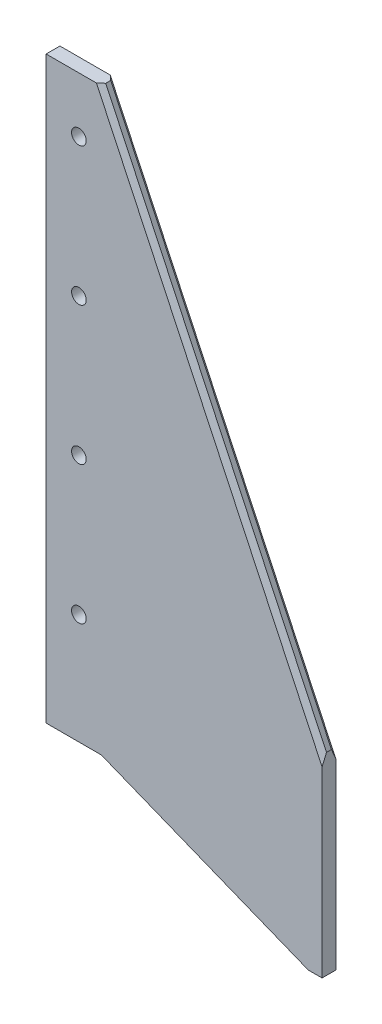
ISO-10303-21;
HEADER;
FILE_DESCRIPTION(('STEP AP214'),'2;1');
FILE_NAME('part.step','',(''),(''),'','','');
FILE_SCHEMA(('AUTOMOTIVE_DESIGN { 1 0 10303 214 1 1 1 1 }'));
ENDSEC;
DATA;
#1=APPLICATION_CONTEXT('core data for automotive mechanical design processes');
#2=APPLICATION_PROTOCOL_DEFINITION('international standard','automotive_design',2000,#1);
#3=PRODUCT_CONTEXT('',#1,'mechanical');
#4=PRODUCT('Part','Part','',(#3));
#5=PRODUCT_RELATED_PRODUCT_CATEGORY('part','',(#4));
#6=PRODUCT_DEFINITION_FORMATION('','',#4);
#7=PRODUCT_DEFINITION_CONTEXT('part definition',#1,'design');
#8=PRODUCT_DEFINITION('design','',#6,#7);
#9=PRODUCT_DEFINITION_SHAPE('','',#8);
#10=(LENGTH_UNIT() NAMED_UNIT(*) SI_UNIT(.MILLI.,.METRE.));
#11=(NAMED_UNIT(*) PLANE_ANGLE_UNIT() SI_UNIT($,.RADIAN.));
#12=(NAMED_UNIT(*) SI_UNIT($,.STERADIAN.) SOLID_ANGLE_UNIT());
#13=UNCERTAINTY_MEASURE_WITH_UNIT(LENGTH_MEASURE(1.E-05),#10,'distance_accuracy_value','');
#14=(GEOMETRIC_REPRESENTATION_CONTEXT(3) GLOBAL_UNCERTAINTY_ASSIGNED_CONTEXT((#13)) GLOBAL_UNIT_ASSIGNED_CONTEXT((#10,
#11,#12)) REPRESENTATION_CONTEXT('',''));
#15=CARTESIAN_POINT('',(0.,0.,0.));
#16=DIRECTION('',(0.,0.,1.));
#17=DIRECTION('',(1.,0.,0.));
#18=AXIS2_PLACEMENT_3D('',#15,#16,#17);
#19=CARTESIAN_POINT('',(-10.31875,12.7,6.35));
#20=DIRECTION('',(0.,0.,1.));
#21=DIRECTION('',(1.,0.,0.));
#22=AXIS2_PLACEMENT_3D('',#19,#20,#21);
#23=CYLINDRICAL_SURFACE('',#22,3.3782);
#24=CARTESIAN_POINT('',(-10.31875,12.7,0.));
#25=DIRECTION('',(0.,0.,1.));
#26=DIRECTION('',(1.,0.,0.));
#27=AXIS2_PLACEMENT_3D('',#24,#25,#26);
#28=CIRCLE('',#27,3.3782);
#29=CARTESIAN_POINT('',(-6.94054999999999,12.7,0.));
#30=VERTEX_POINT('',#29);
#31=EDGE_CURVE('E45',#30,#30,#28,.T.);
#32=ORIENTED_EDGE('',*,*,#31,.F.);
#33=EDGE_LOOP('',(#32));
#34=FACE_BOUND('',#33,.T.);
#35=CARTESIAN_POINT('',(-10.31875,12.7,6.35));
#36=DIRECTION('',(0.,0.,1.));
#37=DIRECTION('',(1.,0.,0.));
#38=AXIS2_PLACEMENT_3D('',#35,#36,#37);
#39=CIRCLE('',#38,3.3782);
#40=CARTESIAN_POINT('',(-6.94054999999999,12.7,6.35));
#41=VERTEX_POINT('',#40);
#42=EDGE_CURVE('E11',#41,#41,#39,.T.);
#43=ORIENTED_EDGE('',*,*,#42,.T.);
#44=EDGE_LOOP('',(#43));
#45=FACE_BOUND('',#44,.T.);
#46=ADVANCED_FACE('F38',(#34,#45),#23,.F.);
#47=CARTESIAN_POINT('',(-10.31875,76.2,6.35));
#48=DIRECTION('',(0.,0.,1.));
#49=DIRECTION('',(1.,0.,0.));
#50=AXIS2_PLACEMENT_3D('',#47,#48,#49);
#51=CYLINDRICAL_SURFACE('',#50,3.3782);
#52=CARTESIAN_POINT('',(-10.31875,76.2,0.));
#53=DIRECTION('',(0.,0.,1.));
#54=DIRECTION('',(1.,0.,0.));
#55=AXIS2_PLACEMENT_3D('',#52,#53,#54);
#56=CIRCLE('',#55,3.3782);
#57=CARTESIAN_POINT('',(-6.94054999999999,76.2,0.));
#58=VERTEX_POINT('',#57);
#59=EDGE_CURVE('E186',#58,#58,#56,.T.);
#60=ORIENTED_EDGE('',*,*,#59,.F.);
#61=EDGE_LOOP('',(#60));
#62=FACE_BOUND('',#61,.T.);
#63=CARTESIAN_POINT('',(-10.31875,76.2,6.35));
#64=DIRECTION('',(0.,0.,1.));
#65=DIRECTION('',(1.,0.,0.));
#66=AXIS2_PLACEMENT_3D('',#63,#64,#65);
#67=CIRCLE('',#66,3.3782);
#68=CARTESIAN_POINT('',(-6.94054999999999,76.2,6.35));
#69=VERTEX_POINT('',#68);
#70=EDGE_CURVE('E189',#69,#69,#67,.T.);
#71=ORIENTED_EDGE('',*,*,#70,.T.);
#72=EDGE_LOOP('',(#71));
#73=FACE_BOUND('',#72,.T.);
#74=ADVANCED_FACE('F198',(#62,#73),#51,.F.);
#75=CARTESIAN_POINT('',(0.,228.6,6.35));
#76=DIRECTION('',(0.904818702200994,0.42579703632988,0.));
#77=DIRECTION('',(-0.42579703632988,0.904818702200994,0.));
#78=AXIS2_PLACEMENT_3D('',#75,#76,#77);
#79=PLANE('',#78);
#80=DIRECTION('',(0.,0.,-1.));
#81=VECTOR('',#80,1.);
#82=CARTESIAN_POINT('',(101.6,12.7,6.35));
#83=LINE('',#82,#81);
#84=CARTESIAN_POINT('',(101.6,12.7,4.31800000000002));
#85=VERTEX_POINT('',#84);
#86=CARTESIAN_POINT('',(101.6,12.7,2.032));
#87=VERTEX_POINT('',#86);
#88=EDGE_CURVE('E129',#85,#87,#83,.T.);
#89=ORIENTED_EDGE('',*,*,#88,.T.);
#90=DIRECTION('',(-0.42579703632988,0.904818702200994,0.));
#91=VECTOR('',#90,1.);
#92=CARTESIAN_POINT('',(0.,228.6,2.032));
#93=LINE('',#92,#91);
#94=CARTESIAN_POINT('',(0.,228.6,2.032));
#95=VERTEX_POINT('',#94);
#96=EDGE_CURVE('E60',#87,#95,#93,.T.);
#97=ORIENTED_EDGE('',*,*,#96,.T.);
#98=DIRECTION('',(0.,0.,-1.));
#99=VECTOR('',#98,1.);
#100=CARTESIAN_POINT('',(0.,228.6,6.35));
#101=LINE('',#100,#99);
#102=CARTESIAN_POINT('',(0.,228.6,4.31800000000002));
#103=VERTEX_POINT('',#102);
#104=EDGE_CURVE('E160',#103,#95,#101,.T.);
#105=ORIENTED_EDGE('',*,*,#104,.F.);
#106=DIRECTION('',(0.42579703632988,-0.904818702200994,0.));
#107=VECTOR('',#106,1.);
#108=CARTESIAN_POINT('',(101.6,12.7,4.31800000000002));
#109=LINE('',#108,#107);
#110=EDGE_CURVE('E177',#103,#85,#109,.T.);
#111=ORIENTED_EDGE('',*,*,#110,.T.);
#112=EDGE_LOOP('',(#89,#97,#105,#111));
#113=FACE_BOUND('',#112,.T.);
#114=ADVANCED_FACE('F222',(#113),#79,.T.);
#115=CARTESIAN_POINT('',(-25.4,228.6,6.35));
#116=DIRECTION('',(0.,1.,0.));
#117=DIRECTION('',(0.,0.,1.));
#118=AXIS2_PLACEMENT_3D('',#115,#116,#117);
#119=PLANE('',#118);
#120=ORIENTED_EDGE('',*,*,#104,.T.);
#121=DIRECTION('',(0.741514825718361,0.,0.670936482269275));
#122=VECTOR('',#121,1.);
#123=CARTESIAN_POINT('',(-11.817798245943,228.6,-8.66096487176723));
#124=LINE('',#123,#122);
#125=CARTESIAN_POINT('',(-2.24575375714178,228.6,0.));
#126=VERTEX_POINT('',#125);
#127=EDGE_CURVE('E183',#95,#126,#124,.F.);
#128=ORIENTED_EDGE('',*,*,#127,.T.);
#129=DIRECTION('',(1.,0.,0.));
#130=VECTOR('',#129,1.);
#131=CARTESIAN_POINT('',(-25.4,228.6,0.));
#132=LINE('',#131,#130);
#133=CARTESIAN_POINT('',(-25.4,228.6,0.));
#134=VERTEX_POINT('',#133);
#135=EDGE_CURVE('E121',#134,#126,#132,.T.);
#136=ORIENTED_EDGE('',*,*,#135,.F.);
#137=DIRECTION('',(0.,0.,-1.));
#138=VECTOR('',#137,1.);
#139=CARTESIAN_POINT('',(-25.4,228.6,6.35));
#140=LINE('',#139,#138);
#141=CARTESIAN_POINT('',(-25.4,228.6,6.35));
#142=VERTEX_POINT('',#141);
#143=EDGE_CURVE('E163',#142,#134,#140,.T.);
#144=ORIENTED_EDGE('',*,*,#143,.F.);
#145=DIRECTION('',(1.,0.,0.));
#146=VECTOR('',#145,1.);
#147=CARTESIAN_POINT('',(-25.4,228.6,6.35));
#148=LINE('',#147,#146);
#149=CARTESIAN_POINT('',(-2.24575375714171,228.6,6.35));
#150=VERTEX_POINT('',#149);
#151=EDGE_CURVE('E144',#142,#150,#148,.T.);
#152=ORIENTED_EDGE('',*,*,#151,.T.);
#153=DIRECTION('',(0.741514825718354,0.,-0.670936482269282));
#154=VECTOR('',#153,1.);
#155=CARTESIAN_POINT('',(-14.976982610302,228.6,17.8694539683405));
#156=LINE('',#155,#154);
#157=EDGE_CURVE('E181',#150,#103,#156,.T.);
#158=ORIENTED_EDGE('',*,*,#157,.T.);
#159=EDGE_LOOP('',(#120,#128,#136,#144,#152,#158));
#160=FACE_BOUND('',#159,.T.);
#161=ADVANCED_FACE('F218',(#160),#119,.T.);
#162=CARTESIAN_POINT('',(-25.4,228.6,6.35));
#163=DIRECTION('',(1.,0.,0.));
#164=DIRECTION('',(0.,1.,0.));
#165=AXIS2_PLACEMENT_3D('',#162,#163,#164);
#166=PLANE('',#165);
#167=DIRECTION('',(0.,-1.,0.));
#168=VECTOR('',#167,1.);
#169=CARTESIAN_POINT('',(-25.4,228.6,0.));
#170=LINE('',#169,#168);
#171=CARTESIAN_POINT('',(-25.4,-38.1,0.));
#172=VERTEX_POINT('',#171);
#173=EDGE_CURVE('E156',#134,#172,#170,.T.);
#174=ORIENTED_EDGE('',*,*,#173,.T.);
#175=DIRECTION('',(0.,0.,-1.));
#176=VECTOR('',#175,1.);
#177=CARTESIAN_POINT('',(-25.4,-38.1,6.35));
#178=LINE('',#177,#176);
#179=CARTESIAN_POINT('',(-25.4,-38.1,6.35));
#180=VERTEX_POINT('',#179);
#181=EDGE_CURVE('E165',#180,#172,#178,.T.);
#182=ORIENTED_EDGE('',*,*,#181,.F.);
#183=DIRECTION('',(0.,-1.,0.));
#184=VECTOR('',#183,1.);
#185=CARTESIAN_POINT('',(-25.4,0.,6.35));
#186=LINE('',#185,#184);
#187=EDGE_CURVE('E142',#142,#180,#186,.T.);
#188=ORIENTED_EDGE('',*,*,#187,.F.);
#189=ORIENTED_EDGE('',*,*,#143,.T.);
#190=EDGE_LOOP('',(#174,#182,#188,#189));
#191=FACE_BOUND('',#190,.T.);
#192=ADVANCED_FACE('F221',(#191),#166,.F.);
#193=CARTESIAN_POINT('',(-25.4,-38.1,6.35));
#194=DIRECTION('',(0.,1.,0.));
#195=DIRECTION('',(0.,0.,1.));
#196=AXIS2_PLACEMENT_3D('',#193,#194,#195);
#197=PLANE('',#196);
#198=DIRECTION('',(1.,0.,0.));
#199=VECTOR('',#198,1.);
#200=CARTESIAN_POINT('',(-25.4,-38.1,0.));
#201=LINE('',#200,#199);
#202=CARTESIAN_POINT('',(0.,-38.1,0.));
#203=VERTEX_POINT('',#202);
#204=EDGE_CURVE('E153',#172,#203,#201,.T.);
#205=ORIENTED_EDGE('',*,*,#204,.T.);
#206=DIRECTION('',(0.,0.,-1.));
#207=VECTOR('',#206,1.);
#208=CARTESIAN_POINT('',(0.,-38.1,6.35));
#209=LINE('',#208,#207);
#210=CARTESIAN_POINT('',(0.,-38.1,6.35));
#211=VERTEX_POINT('',#210);
#212=EDGE_CURVE('E168',#211,#203,#209,.T.);
#213=ORIENTED_EDGE('',*,*,#212,.F.);
#214=DIRECTION('',(1.,0.,0.));
#215=VECTOR('',#214,1.);
#216=CARTESIAN_POINT('',(-25.4,-38.1,6.35));
#217=LINE('',#216,#215);
#218=EDGE_CURVE('E137',#180,#211,#217,.T.);
#219=ORIENTED_EDGE('',*,*,#218,.F.);
#220=ORIENTED_EDGE('',*,*,#181,.T.);
#221=EDGE_LOOP('',(#205,#213,#219,#220));
#222=FACE_BOUND('',#221,.T.);
#223=ADVANCED_FACE('F226',(#222),#197,.F.);
#224=CARTESIAN_POINT('',(95.25,-76.2,6.35));
#225=DIRECTION('',(-0.371390676354103,-0.928476690885259,0.));
#226=DIRECTION('',(0.92847669088526,-0.371390676354103,0.));
#227=AXIS2_PLACEMENT_3D('',#224,#225,#226);
#228=PLANE('',#227);
#229=DIRECTION('',(-0.928476690885259,0.371390676354103,0.));
#230=VECTOR('',#229,1.);
#231=CARTESIAN_POINT('',(95.25,-76.2,0.));
#232=LINE('',#231,#230);
#233=CARTESIAN_POINT('',(95.25,-76.2,0.));
#234=VERTEX_POINT('',#233);
#235=EDGE_CURVE('E150',#234,#203,#232,.T.);
#236=ORIENTED_EDGE('',*,*,#235,.F.);
#237=DIRECTION('',(0.,0.,-1.));
#238=VECTOR('',#237,1.);
#239=CARTESIAN_POINT('',(95.25,-76.2,6.35));
#240=LINE('',#239,#238);
#241=CARTESIAN_POINT('',(95.25,-76.2,6.35));
#242=VERTEX_POINT('',#241);
#243=EDGE_CURVE('E128',#242,#234,#240,.T.);
#244=ORIENTED_EDGE('',*,*,#243,.F.);
#245=DIRECTION('',(-0.928476690885259,0.371390676354103,0.));
#246=VECTOR('',#245,1.);
#247=CARTESIAN_POINT('',(95.25,-76.2,6.35));
#248=LINE('',#247,#246);
#249=EDGE_CURVE('E135',#242,#211,#248,.T.);
#250=ORIENTED_EDGE('',*,*,#249,.T.);
#251=ORIENTED_EDGE('',*,*,#212,.T.);
#252=EDGE_LOOP('',(#236,#244,#250,#251));
#253=FACE_BOUND('',#252,.T.);
#254=ADVANCED_FACE('F230',(#253),#228,.T.);
#255=CARTESIAN_POINT('',(101.6,-76.2,6.35));
#256=DIRECTION('',(0.,-1.,0.));
#257=DIRECTION('',(1.,0.,0.));
#258=AXIS2_PLACEMENT_3D('',#255,#256,#257);
#259=PLANE('',#258);
#260=DIRECTION('',(-1.,0.,0.));
#261=VECTOR('',#260,1.);
#262=CARTESIAN_POINT('',(101.6,-76.2,0.));
#263=LINE('',#262,#261);
#264=CARTESIAN_POINT('',(101.6,-76.2,0.));
#265=VERTEX_POINT('',#264);
#266=EDGE_CURVE('E127',#265,#234,#263,.T.);
#267=ORIENTED_EDGE('',*,*,#266,.F.);
#268=DIRECTION('',(0.,0.,-1.));
#269=VECTOR('',#268,1.);
#270=CARTESIAN_POINT('',(101.6,-76.2,6.35));
#271=LINE('',#270,#269);
#272=CARTESIAN_POINT('',(101.6,-76.2,6.35));
#273=VERTEX_POINT('',#272);
#274=EDGE_CURVE('E115',#273,#265,#271,.T.);
#275=ORIENTED_EDGE('',*,*,#274,.F.);
#276=DIRECTION('',(-1.,0.,0.));
#277=VECTOR('',#276,1.);
#278=CARTESIAN_POINT('',(101.6,-76.2,6.35));
#279=LINE('',#278,#277);
#280=EDGE_CURVE('E120',#273,#242,#279,.T.);
#281=ORIENTED_EDGE('',*,*,#280,.T.);
#282=ORIENTED_EDGE('',*,*,#243,.T.);
#283=EDGE_LOOP('',(#267,#275,#281,#282));
#284=FACE_BOUND('',#283,.T.);
#285=ADVANCED_FACE('F125',(#284),#259,.T.);
#286=CARTESIAN_POINT('',(101.6,12.7,6.35));
#287=DIRECTION('',(1.,0.,0.));
#288=DIRECTION('',(0.,1.,0.));
#289=AXIS2_PLACEMENT_3D('',#286,#287,#288);
#290=PLANE('',#289);
#291=DIRECTION('',(0.,-1.,0.));
#292=VECTOR('',#291,1.);
#293=CARTESIAN_POINT('',(101.6,12.7,0.));
#294=LINE('',#293,#292);
#295=CARTESIAN_POINT('',(101.6,7.92777326607371,0.));
#296=VERTEX_POINT('',#295);
#297=EDGE_CURVE('E146',#296,#265,#294,.T.);
#298=ORIENTED_EDGE('',*,*,#297,.F.);
#299=DIRECTION('',(0.,-0.920066726805499,-0.391761685499509));
#300=VECTOR('',#299,1.);
#301=CARTESIAN_POINT('',(101.6,14.2564096782109,2.69471462829735));
#302=LINE('',#301,#300);
#303=EDGE_CURVE('E175',#296,#87,#302,.F.);
#304=ORIENTED_EDGE('',*,*,#303,.T.);
#305=ORIENTED_EDGE('',*,*,#88,.F.);
#306=DIRECTION('',(0.,-0.920066726805496,0.391761685499516));
#307=VECTOR('',#306,1.);
#308=CARTESIAN_POINT('',(101.6,11.967571916136,4.62986570743407));
#309=LINE('',#308,#307);
#310=CARTESIAN_POINT('',(101.6,7.9277732660739,6.35));
#311=VERTEX_POINT('',#310);
#312=EDGE_CURVE('E118',#85,#311,#309,.T.);
#313=ORIENTED_EDGE('',*,*,#312,.T.);
#314=DIRECTION('',(0.,-1.,0.));
#315=VECTOR('',#314,1.);
#316=CARTESIAN_POINT('',(101.6,12.7,6.35));
#317=LINE('',#316,#315);
#318=EDGE_CURVE('E111',#311,#273,#317,.T.);
#319=ORIENTED_EDGE('',*,*,#318,.T.);
#320=ORIENTED_EDGE('',*,*,#274,.T.);
#321=EDGE_LOOP('',(#298,#304,#305,#313,#319,#320));
#322=FACE_BOUND('',#321,.T.);
#323=ADVANCED_FACE('F114',(#322),#290,.T.);
#324=CARTESIAN_POINT('',(0.,0.,6.35));
#325=DIRECTION('',(0.,0.,-1.));
#326=DIRECTION('',(-1.,0.,0.));
#327=AXIS2_PLACEMENT_3D('',#324,#325,#326);
#328=PLANE('',#327);
#329=CARTESIAN_POINT('',(-10.31875,139.7,6.35));
#330=DIRECTION('',(0.,0.,1.));
#331=DIRECTION('',(1.,0.,0.));
#332=AXIS2_PLACEMENT_3D('',#329,#330,#331);
#333=CIRCLE('',#332,3.3782);
#334=CARTESIAN_POINT('',(-6.94055,139.7,6.35));
#335=VERTEX_POINT('',#334);
#336=EDGE_CURVE('E343',#335,#335,#333,.T.);
#337=ORIENTED_EDGE('',*,*,#336,.F.);
#338=EDGE_LOOP('',(#337));
#339=FACE_BOUND('',#338,.T.);
#340=CARTESIAN_POINT('',(-10.31875,203.2,6.35));
#341=DIRECTION('',(0.,0.,1.));
#342=DIRECTION('',(1.,0.,0.));
#343=AXIS2_PLACEMENT_3D('',#340,#341,#342);
#344=CIRCLE('',#343,3.3782);
#345=CARTESIAN_POINT('',(-6.94055,203.2,6.35));
#346=VERTEX_POINT('',#345);
#347=EDGE_CURVE('E344',#346,#346,#344,.T.);
#348=ORIENTED_EDGE('',*,*,#347,.F.);
#349=EDGE_LOOP('',(#348));
#350=FACE_BOUND('',#349,.T.);
#351=ORIENTED_EDGE('',*,*,#318,.F.);
#352=DIRECTION('',(-0.42579703632988,0.904818702200994,0.));
#353=VECTOR('',#352,1.);
#354=CARTESIAN_POINT('',(-1.83859160287238,227.734780422178,6.35));
#355=LINE('',#354,#353);
#356=EDGE_CURVE('E52',#311,#150,#355,.T.);
#357=ORIENTED_EDGE('',*,*,#356,.T.);
#358=ORIENTED_EDGE('',*,*,#151,.F.);
#359=ORIENTED_EDGE('',*,*,#187,.T.);
#360=ORIENTED_EDGE('',*,*,#218,.T.);
#361=ORIENTED_EDGE('',*,*,#249,.F.);
#362=ORIENTED_EDGE('',*,*,#280,.F.);
#363=EDGE_LOOP('',(#351,#357,#358,#359,#360,#361,#362));
#364=FACE_BOUND('',#363,.T.);
#365=ORIENTED_EDGE('',*,*,#70,.F.);
#366=EDGE_LOOP('',(#365));
#367=FACE_BOUND('',#366,.T.);
#368=ORIENTED_EDGE('',*,*,#42,.F.);
#369=EDGE_LOOP('',(#368));
#370=FACE_BOUND('',#369,.T.);
#371=ADVANCED_FACE('F132',(#339,#350,#364,#367,#370),#328,.F.);
#372=CARTESIAN_POINT('',(0.,0.,0.));
#373=DIRECTION('',(0.,0.,-1.));
#374=DIRECTION('',(-1.,0.,0.));
#375=AXIS2_PLACEMENT_3D('',#372,#373,#374);
#376=PLANE('',#375);
#377=CARTESIAN_POINT('',(-10.31875,139.7,0.));
#378=DIRECTION('',(0.,0.,1.));
#379=DIRECTION('',(1.,0.,0.));
#380=AXIS2_PLACEMENT_3D('',#377,#378,#379);
#381=CIRCLE('',#380,3.3782);
#382=CARTESIAN_POINT('',(-6.94055,139.7,0.));
#383=VERTEX_POINT('',#382);
#384=EDGE_CURVE('E341',#383,#383,#381,.T.);
#385=ORIENTED_EDGE('',*,*,#384,.T.);
#386=EDGE_LOOP('',(#385));
#387=FACE_BOUND('',#386,.T.);
#388=CARTESIAN_POINT('',(-10.31875,203.2,0.));
#389=DIRECTION('',(0.,0.,1.));
#390=DIRECTION('',(1.,0.,0.));
#391=AXIS2_PLACEMENT_3D('',#388,#389,#390);
#392=CIRCLE('',#391,3.3782);
#393=CARTESIAN_POINT('',(-6.94055,203.2,0.));
#394=VERTEX_POINT('',#393);
#395=EDGE_CURVE('E148',#394,#394,#392,.T.);
#396=ORIENTED_EDGE('',*,*,#395,.T.);
#397=EDGE_LOOP('',(#396));
#398=FACE_BOUND('',#397,.T.);
#399=ORIENTED_EDGE('',*,*,#135,.T.);
#400=DIRECTION('',(0.42579703632988,-0.904818702200994,0.));
#401=VECTOR('',#400,1.);
#402=CARTESIAN_POINT('',(86.2339296435865,40.5806727734525,0.));
#403=LINE('',#402,#401);
#404=EDGE_CURVE('E162',#126,#296,#403,.T.);
#405=ORIENTED_EDGE('',*,*,#404,.T.);
#406=ORIENTED_EDGE('',*,*,#297,.T.);
#407=ORIENTED_EDGE('',*,*,#266,.T.);
#408=ORIENTED_EDGE('',*,*,#235,.T.);
#409=ORIENTED_EDGE('',*,*,#204,.F.);
#410=ORIENTED_EDGE('',*,*,#173,.F.);
#411=EDGE_LOOP('',(#399,#405,#406,#407,#408,#409,#410));
#412=FACE_BOUND('',#411,.T.);
#413=ORIENTED_EDGE('',*,*,#59,.T.);
#414=EDGE_LOOP('',(#413));
#415=FACE_BOUND('',#414,.T.);
#416=ORIENTED_EDGE('',*,*,#31,.T.);
#417=EDGE_LOOP('',(#416));
#418=FACE_BOUND('',#417,.T.);
#419=ADVANCED_FACE('F194',(#387,#398,#412,#415,#418),#376,.T.);
#420=CARTESIAN_POINT('',(86.2339296435865,40.5806727734525,0.));
#421=DIRECTION('',(-0.63980344007073,-0.301083971797991,0.707106781186552));
#422=DIRECTION('',(0.42579703632988,-0.904818702200994,0.));
#423=AXIS2_PLACEMENT_3D('',#420,#421,#422);
#424=PLANE('',#423);
#425=ORIENTED_EDGE('',*,*,#127,.F.);
#426=ORIENTED_EDGE('',*,*,#96,.F.);
#427=ORIENTED_EDGE('',*,*,#303,.F.);
#428=ORIENTED_EDGE('',*,*,#404,.F.);
#429=EDGE_LOOP('',(#425,#426,#427,#428));
#430=FACE_BOUND('',#429,.T.);
#431=ADVANCED_FACE('F208',(#430),#424,.F.);
#432=CARTESIAN_POINT('',(0.,228.6,4.31800000000002));
#433=DIRECTION('',(0.639803440070737,0.301083971797994,0.707106781186545));
#434=DIRECTION('',(-0.42579703632988,0.904818702200994,0.));
#435=AXIS2_PLACEMENT_3D('',#432,#433,#434);
#436=PLANE('',#435);
#437=ORIENTED_EDGE('',*,*,#157,.F.);
#438=ORIENTED_EDGE('',*,*,#356,.F.);
#439=ORIENTED_EDGE('',*,*,#312,.F.);
#440=ORIENTED_EDGE('',*,*,#110,.F.);
#441=EDGE_LOOP('',(#437,#438,#439,#440));
#442=FACE_BOUND('',#441,.T.);
#443=ADVANCED_FACE('F245',(#442),#436,.T.);
#444=CARTESIAN_POINT('',(-10.31875,203.2,6.35));
#445=DIRECTION('',(0.,0.,1.));
#446=DIRECTION('',(1.,0.,0.));
#447=AXIS2_PLACEMENT_3D('',#444,#445,#446);
#448=CYLINDRICAL_SURFACE('',#447,3.3782);
#449=ORIENTED_EDGE('',*,*,#395,.F.);
#450=EDGE_LOOP('',(#449));
#451=FACE_BOUND('',#450,.T.);
#452=ORIENTED_EDGE('',*,*,#347,.T.);
#453=EDGE_LOOP('',(#452));
#454=FACE_BOUND('',#453,.T.);
#455=ADVANCED_FACE('F215',(#451,#454),#448,.F.);
#456=CARTESIAN_POINT('',(-10.31875,139.7,6.35));
#457=DIRECTION('',(0.,0.,1.));
#458=DIRECTION('',(1.,0.,0.));
#459=AXIS2_PLACEMENT_3D('',#456,#457,#458);
#460=CYLINDRICAL_SURFACE('',#459,3.3782);
#461=ORIENTED_EDGE('',*,*,#384,.F.);
#462=EDGE_LOOP('',(#461));
#463=FACE_BOUND('',#462,.T.);
#464=ORIENTED_EDGE('',*,*,#336,.T.);
#465=EDGE_LOOP('',(#464));
#466=FACE_BOUND('',#465,.T.);
#467=ADVANCED_FACE('F311',(#463,#466),#460,.F.);
#468=CLOSED_SHELL('',(#46,#74,#114,#161,#192,#223,#254,#285,#323,#371,#419,#431,#443,#455,#467));
#469=MANIFOLD_SOLID_BREP('B2',#468);
#470=ADVANCED_BREP_SHAPE_REPRESENTATION('',(#18,#469),#14);
#471=SHAPE_DEFINITION_REPRESENTATION(#9,#470);
ENDSEC;
END-ISO-10303-21;
